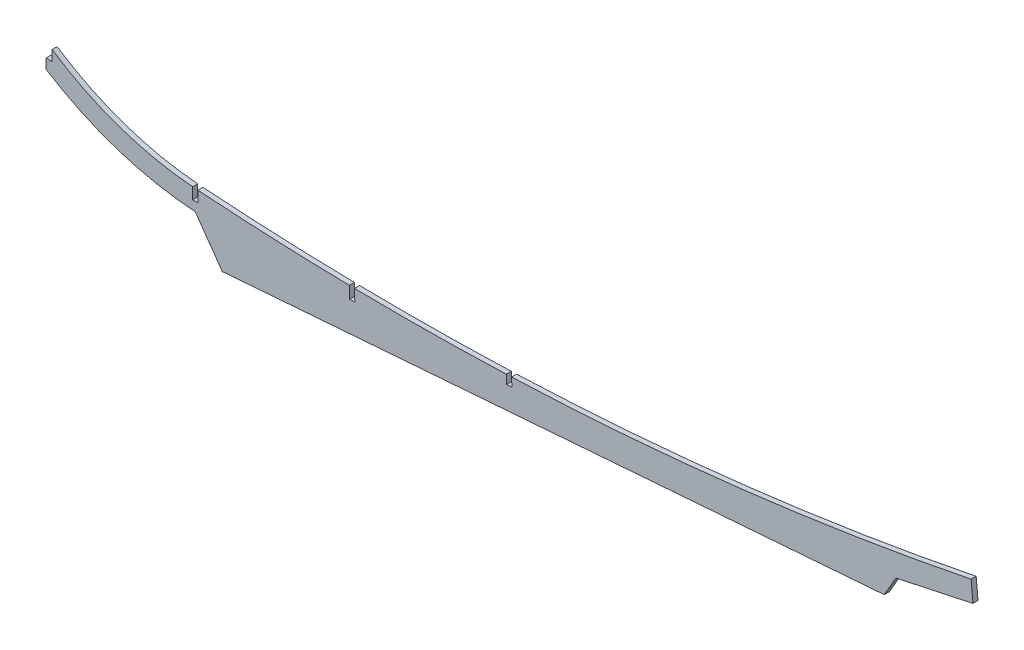
ISO-10303-21;
HEADER;
FILE_DESCRIPTION(('STEP AP214'),'2;1');
FILE_NAME('part.step','',(''),(''),'','','');
FILE_SCHEMA(('AUTOMOTIVE_DESIGN { 1 0 10303 214 1 1 1 1 }'));
ENDSEC;
DATA;
#1=APPLICATION_CONTEXT('core data for automotive mechanical design processes');
#2=APPLICATION_PROTOCOL_DEFINITION('international standard','automotive_design',2000,#1);
#3=PRODUCT_CONTEXT('',#1,'mechanical');
#4=PRODUCT('Part','Part','',(#3));
#5=PRODUCT_RELATED_PRODUCT_CATEGORY('part','',(#4));
#6=PRODUCT_DEFINITION_FORMATION('','',#4);
#7=PRODUCT_DEFINITION_CONTEXT('part definition',#1,'design');
#8=PRODUCT_DEFINITION('design','',#6,#7);
#9=PRODUCT_DEFINITION_SHAPE('','',#8);
#10=(LENGTH_UNIT() NAMED_UNIT(*) SI_UNIT(.MILLI.,.METRE.));
#11=(NAMED_UNIT(*) PLANE_ANGLE_UNIT() SI_UNIT($,.RADIAN.));
#12=(NAMED_UNIT(*) SI_UNIT($,.STERADIAN.) SOLID_ANGLE_UNIT());
#13=UNCERTAINTY_MEASURE_WITH_UNIT(LENGTH_MEASURE(1.E-05),#10,'distance_accuracy_value','');
#14=(GEOMETRIC_REPRESENTATION_CONTEXT(3) GLOBAL_UNCERTAINTY_ASSIGNED_CONTEXT((#13)) GLOBAL_UNIT_ASSIGNED_CONTEXT((#10,
#11,#12)) REPRESENTATION_CONTEXT('',''));
#15=CARTESIAN_POINT('',(0.,0.,0.));
#16=DIRECTION('',(0.,0.,1.));
#17=DIRECTION('',(1.,0.,0.));
#18=AXIS2_PLACEMENT_3D('',#15,#16,#17);
#19=CARTESIAN_POINT('',(223.035341524401,1702.00163611654,1.5875));
#20=DIRECTION('',(0.,0.,-1.));
#21=DIRECTION('',(-1.,0.,0.));
#22=AXIS2_PLACEMENT_3D('',#19,#20,#21);
#23=CYLINDRICAL_SURFACE('',#22,1822.13675841609);
#24=CARTESIAN_POINT('',(223.035341524401,1702.00163611654,-1.5875));
#25=DIRECTION('',(0.,0.,1.));
#26=DIRECTION('',(1.,0.,0.));
#27=AXIS2_PLACEMENT_3D('',#24,#25,#26);
#28=CIRCLE('',#27,1822.13675841609);
#29=CARTESIAN_POINT('',(293.057765069037,-118.789188380336,-1.5875));
#30=VERTEX_POINT('',#29);
#31=CARTESIAN_POINT('',(582.369809331586,-84.3525019582167,-1.5875));
#32=VERTEX_POINT('',#31);
#33=EDGE_CURVE('E215',#30,#32,#28,.T.);
#34=ORIENTED_EDGE('',*,*,#33,.F.);
#35=DIRECTION('',(0.,0.,-1.));
#36=VECTOR('',#35,1.);
#37=CARTESIAN_POINT('',(293.057765069037,-118.789188380336,1.5875));
#38=LINE('',#37,#36);
#39=CARTESIAN_POINT('',(293.057765069037,-118.789188380336,1.5875));
#40=VERTEX_POINT('',#39);
#41=EDGE_CURVE('E11',#40,#30,#38,.T.);
#42=ORIENTED_EDGE('',*,*,#41,.F.);
#43=CARTESIAN_POINT('',(223.035341524401,1702.00163611654,1.5875));
#44=DIRECTION('',(0.,0.,1.));
#45=DIRECTION('',(1.,0.,0.));
#46=AXIS2_PLACEMENT_3D('',#43,#44,#45);
#47=CIRCLE('',#46,1822.13675841609);
#48=CARTESIAN_POINT('',(582.369809331586,-84.3525019582167,1.5875));
#49=VERTEX_POINT('',#48);
#50=EDGE_CURVE('E273',#40,#49,#47,.T.);
#51=ORIENTED_EDGE('',*,*,#50,.T.);
#52=DIRECTION('',(0.,0.,-1.));
#53=VECTOR('',#52,1.);
#54=CARTESIAN_POINT('',(582.369809331586,-84.3525019582167,1.5875));
#55=LINE('',#54,#53);
#56=EDGE_CURVE('E132',#49,#32,#55,.T.);
#57=ORIENTED_EDGE('',*,*,#56,.T.);
#58=EDGE_LOOP('',(#34,#42,#51,#57));
#59=FACE_BOUND('',#58,.T.);
#60=ADVANCED_FACE('F39',(#59),#23,.F.);
#61=CARTESIAN_POINT('',(287.412679305903,12.3702094611246,1.5875));
#62=DIRECTION('',(-0.999075068861156,-0.0430000788380186,0.));
#63=DIRECTION('',(0.0430000788380186,-0.999075068861156,0.));
#64=AXIS2_PLACEMENT_3D('',#61,#62,#63);
#65=PLANE('',#64);
#66=DIRECTION('',(-0.0430000788380186,0.999075068861156,0.));
#67=VECTOR('',#66,1.);
#68=CARTESIAN_POINT('',(287.412679305903,12.3702094611246,-1.5875));
#69=LINE('',#68,#67);
#70=CARTESIAN_POINT('',(293.291810232831,-124.22705487856,-1.5875));
#71=VERTEX_POINT('',#70);
#72=EDGE_CURVE('E218',#71,#30,#69,.T.);
#73=ORIENTED_EDGE('',*,*,#72,.F.);
#74=DIRECTION('',(0.,0.,-1.));
#75=VECTOR('',#74,1.);
#76=CARTESIAN_POINT('',(293.291810232831,-124.22705487856,1.5875));
#77=LINE('',#76,#75);
#78=CARTESIAN_POINT('',(293.291810232831,-124.22705487856,1.5875));
#79=VERTEX_POINT('',#78);
#80=EDGE_CURVE('E47',#79,#71,#77,.T.);
#81=ORIENTED_EDGE('',*,*,#80,.F.);
#82=DIRECTION('',(-0.0430000788380186,0.999075068861156,0.));
#83=VECTOR('',#82,1.);
#84=CARTESIAN_POINT('',(287.412679305903,12.3702094611246,1.5875));
#85=LINE('',#84,#83);
#86=EDGE_CURVE('E335',#79,#40,#85,.T.);
#87=ORIENTED_EDGE('',*,*,#86,.T.);
#88=ORIENTED_EDGE('',*,*,#41,.T.);
#89=EDGE_LOOP('',(#73,#81,#87,#88));
#90=FACE_BOUND('',#89,.T.);
#91=ADVANCED_FACE('F320',(#90),#65,.T.);
#92=CARTESIAN_POINT('',(5.87913092691155,-136.597264339654,1.5875));
#93=DIRECTION('',(-0.0430000788379098,0.999075068861161,0.));
#94=DIRECTION('',(-0.999075068861161,-0.0430000788379098,0.));
#95=AXIS2_PLACEMENT_3D('',#92,#93,#94);
#96=PLANE('',#95);
#97=DIRECTION('',(0.999075068861161,0.0430000788379098,0.));
#98=VECTOR('',#97,1.);
#99=CARTESIAN_POINT('',(5.87913092691155,-136.597264339654,-1.5875));
#100=LINE('',#99,#98);
#101=CARTESIAN_POINT('',(289.992864355451,-124.369041138883,-1.5875));
#102=VERTEX_POINT('',#101);
#103=EDGE_CURVE('E221',#102,#71,#100,.T.);
#104=ORIENTED_EDGE('',*,*,#103,.F.);
#105=DIRECTION('',(0.,0.,-1.));
#106=VECTOR('',#105,1.);
#107=CARTESIAN_POINT('',(289.992864355451,-124.369041138883,1.5875));
#108=LINE('',#107,#106);
#109=CARTESIAN_POINT('',(289.992864355451,-124.369041138883,1.5875));
#110=VERTEX_POINT('',#109);
#111=EDGE_CURVE('E309',#110,#102,#108,.T.);
#112=ORIENTED_EDGE('',*,*,#111,.F.);
#113=DIRECTION('',(0.999075068861161,0.0430000788379098,0.));
#114=VECTOR('',#113,1.);
#115=CARTESIAN_POINT('',(5.87913092691155,-136.597264339654,1.5875));
#116=LINE('',#115,#114);
#117=EDGE_CURVE('E316',#110,#79,#116,.T.);
#118=ORIENTED_EDGE('',*,*,#117,.T.);
#119=ORIENTED_EDGE('',*,*,#80,.T.);
#120=EDGE_LOOP('',(#104,#112,#118,#119));
#121=FACE_BOUND('',#120,.T.);
#122=ADVANCED_FACE('F314',(#121),#96,.T.);
#123=CARTESIAN_POINT('',(284.113733428526,12.2282232007967,1.5875));
#124=DIRECTION('',(-0.999075068861157,-0.0430000788380014,0.));
#125=DIRECTION('',(0.0430000788380014,-0.999075068861157,0.));
#126=AXIS2_PLACEMENT_3D('',#123,#124,#125);
#127=PLANE('',#126);
#128=DIRECTION('',(-0.0430000788380014,0.999075068861157,0.));
#129=VECTOR('',#128,1.);
#130=CARTESIAN_POINT('',(284.113733428526,12.2282232007967,-1.5875));
#131=LINE('',#130,#129);
#132=CARTESIAN_POINT('',(289.758040924917,-118.913092187832,-1.5875));
#133=VERTEX_POINT('',#132);
#134=EDGE_CURVE('E224',#102,#133,#131,.T.);
#135=ORIENTED_EDGE('',*,*,#134,.T.);
#136=DIRECTION('',(0.,0.,-1.));
#137=VECTOR('',#136,1.);
#138=CARTESIAN_POINT('',(289.758040924917,-118.913092187832,1.5875));
#139=LINE('',#138,#137);
#140=CARTESIAN_POINT('',(289.758040924917,-118.913092187832,1.5875));
#141=VERTEX_POINT('',#140);
#142=EDGE_CURVE('E307',#141,#133,#139,.T.);
#143=ORIENTED_EDGE('',*,*,#142,.F.);
#144=DIRECTION('',(-0.0430000788380014,0.999075068861157,0.));
#145=VECTOR('',#144,1.);
#146=CARTESIAN_POINT('',(284.113733428526,12.2282232007967,1.5875));
#147=LINE('',#146,#145);
#148=EDGE_CURVE('E331',#110,#141,#147,.T.);
#149=ORIENTED_EDGE('',*,*,#148,.F.);
#150=ORIENTED_EDGE('',*,*,#111,.T.);
#151=EDGE_LOOP('',(#135,#143,#149,#150));
#152=FACE_BOUND('',#151,.T.);
#153=ADVANCED_FACE('F328',(#152),#127,.F.);
#154=CARTESIAN_POINT('',(223.035341524401,1702.00163611654,1.5875));
#155=DIRECTION('',(0.,0.,-1.));
#156=DIRECTION('',(-1.,0.,0.));
#157=AXIS2_PLACEMENT_3D('',#154,#155,#156);
#158=CYLINDRICAL_SURFACE('',#157,1822.13675841609);
#159=CARTESIAN_POINT('',(223.035341524401,1702.00163611654,-1.5875));
#160=DIRECTION('',(0.,0.,1.));
#161=DIRECTION('',(1.,0.,0.));
#162=AXIS2_PLACEMENT_3D('',#159,#160,#161);
#163=CIRCLE('',#162,1822.13675841609);
#164=CARTESIAN_POINT('',(194.235436281596,-119.907508662387,-1.5875));
#165=VERTEX_POINT('',#164);
#166=EDGE_CURVE('E227',#165,#133,#163,.T.);
#167=ORIENTED_EDGE('',*,*,#166,.F.);
#168=DIRECTION('',(0.,0.,-1.));
#169=VECTOR('',#168,1.);
#170=CARTESIAN_POINT('',(194.235436281596,-119.907508662387,1.5875));
#171=LINE('',#170,#169);
#172=CARTESIAN_POINT('',(194.235436281596,-119.907508662387,1.5875));
#173=VERTEX_POINT('',#172);
#174=EDGE_CURVE('E305',#173,#165,#171,.T.);
#175=ORIENTED_EDGE('',*,*,#174,.F.);
#176=CARTESIAN_POINT('',(223.035341524401,1702.00163611654,1.5875));
#177=DIRECTION('',(0.,0.,1.));
#178=DIRECTION('',(1.,0.,0.));
#179=AXIS2_PLACEMENT_3D('',#176,#177,#178);
#180=CIRCLE('',#179,1822.13675841609);
#181=EDGE_CURVE('E333',#173,#141,#180,.T.);
#182=ORIENTED_EDGE('',*,*,#181,.T.);
#183=ORIENTED_EDGE('',*,*,#142,.T.);
#184=EDGE_LOOP('',(#167,#175,#182,#183));
#185=FACE_BOUND('',#184,.T.);
#186=ADVANCED_FACE('F400',(#185),#158,.F.);
#187=CARTESIAN_POINT('',(191.64119605423,4.01198617440464,1.5875));
#188=DIRECTION('',(0.999780937323449,0.0209302977677093,0.));
#189=DIRECTION('',(-0.0209302977677093,0.99978093732345,0.));
#190=AXIS2_PLACEMENT_3D('',#187,#188,#189);
#191=PLANE('',#190);
#192=DIRECTION('',(0.0209302977677093,-0.99978093732345,0.));
#193=VECTOR('',#192,1.);
#194=CARTESIAN_POINT('',(191.64119605423,4.01198617440464,-1.5875));
#195=LINE('',#194,#193);
#196=CARTESIAN_POINT('',(194.389608854953,-127.271895046712,-1.5875));
#197=VERTEX_POINT('',#196);
#198=EDGE_CURVE('E230',#165,#197,#195,.T.);
#199=ORIENTED_EDGE('',*,*,#198,.T.);
#200=DIRECTION('',(0.,0.,-1.));
#201=VECTOR('',#200,1.);
#202=CARTESIAN_POINT('',(194.389608854953,-127.271895046712,1.5875));
#203=LINE('',#202,#201);
#204=CARTESIAN_POINT('',(194.389608854953,-127.271895046712,1.5875));
#205=VERTEX_POINT('',#204);
#206=EDGE_CURVE('E303',#205,#197,#203,.T.);
#207=ORIENTED_EDGE('',*,*,#206,.F.);
#208=DIRECTION('',(0.0209302977677093,-0.99978093732345,0.));
#209=VECTOR('',#208,1.);
#210=CARTESIAN_POINT('',(191.64119605423,4.01198617440464,1.5875));
#211=LINE('',#210,#209);
#212=EDGE_CURVE('E341',#173,#205,#211,.T.);
#213=ORIENTED_EDGE('',*,*,#212,.F.);
#214=ORIENTED_EDGE('',*,*,#174,.T.);
#215=EDGE_LOOP('',(#199,#207,#213,#214));
#216=FACE_BOUND('',#215,.T.);
#217=ADVANCED_FACE('F403',(#216),#191,.F.);
#218=CARTESIAN_POINT('',(2.74841280072267,-131.283881221117,1.5875));
#219=DIRECTION('',(-0.0209302977677072,0.99978093732345,0.));
#220=DIRECTION('',(-0.99978093732345,-0.0209302977677072,0.));
#221=AXIS2_PLACEMENT_3D('',#218,#219,#220);
#222=PLANE('',#221);
#223=DIRECTION('',(0.99978093732345,0.0209302977677072,0.));
#224=VECTOR('',#223,1.);
#225=CARTESIAN_POINT('',(2.74841280072267,-131.283881221117,-1.5875));
#226=LINE('',#225,#224);
#227=CARTESIAN_POINT('',(191.088332199911,-127.341006889941,-1.5875));
#228=VERTEX_POINT('',#227);
#229=EDGE_CURVE('E233',#228,#197,#226,.T.);
#230=ORIENTED_EDGE('',*,*,#229,.F.);
#231=DIRECTION('',(0.,0.,-1.));
#232=VECTOR('',#231,1.);
#233=CARTESIAN_POINT('',(191.088332199911,-127.341006889941,1.5875));
#234=LINE('',#233,#232);
#235=CARTESIAN_POINT('',(191.088332199911,-127.341006889941,1.5875));
#236=VERTEX_POINT('',#235);
#237=EDGE_CURVE('E301',#236,#228,#234,.T.);
#238=ORIENTED_EDGE('',*,*,#237,.F.);
#239=DIRECTION('',(0.99978093732345,0.0209302977677072,0.));
#240=VECTOR('',#239,1.);
#241=CARTESIAN_POINT('',(2.74841280072267,-131.283881221117,1.5875));
#242=LINE('',#241,#240);
#243=EDGE_CURVE('E343',#236,#205,#242,.T.);
#244=ORIENTED_EDGE('',*,*,#243,.T.);
#245=ORIENTED_EDGE('',*,*,#206,.T.);
#246=EDGE_LOOP('',(#230,#238,#244,#245));
#247=FACE_BOUND('',#246,.T.);
#248=ADVANCED_FACE('F407',(#247),#222,.T.);
#249=CARTESIAN_POINT('',(188.339919399188,3.9428743311757,1.5875));
#250=DIRECTION('',(0.999780937323449,0.0209302977677095,0.));
#251=DIRECTION('',(-0.0209302977677095,0.99978093732345,0.));
#252=AXIS2_PLACEMENT_3D('',#249,#250,#251);
#253=PLANE('',#252);
#254=DIRECTION('',(0.0209302977677095,-0.99978093732345,0.));
#255=VECTOR('',#254,1.);
#256=CARTESIAN_POINT('',(188.339919399188,3.9428743311757,-1.5875));
#257=LINE('',#256,#255);
#258=CARTESIAN_POINT('',(190.931556697202,-119.852285955932,-1.5875));
#259=VERTEX_POINT('',#258);
#260=EDGE_CURVE('E236',#259,#228,#257,.T.);
#261=ORIENTED_EDGE('',*,*,#260,.F.);
#262=DIRECTION('',(0.,0.,-1.));
#263=VECTOR('',#262,1.);
#264=CARTESIAN_POINT('',(190.931556697202,-119.852285955932,1.5875));
#265=LINE('',#264,#263);
#266=CARTESIAN_POINT('',(190.931556697202,-119.852285955932,1.5875));
#267=VERTEX_POINT('',#266);
#268=EDGE_CURVE('E299',#267,#259,#265,.T.);
#269=ORIENTED_EDGE('',*,*,#268,.F.);
#270=DIRECTION('',(0.0209302977677095,-0.99978093732345,0.));
#271=VECTOR('',#270,1.);
#272=CARTESIAN_POINT('',(188.339919399188,3.9428743311757,1.5875));
#273=LINE('',#272,#271);
#274=EDGE_CURVE('E346',#267,#236,#273,.T.);
#275=ORIENTED_EDGE('',*,*,#274,.T.);
#276=ORIENTED_EDGE('',*,*,#237,.T.);
#277=EDGE_LOOP('',(#261,#269,#275,#276));
#278=FACE_BOUND('',#277,.T.);
#279=ADVANCED_FACE('F411',(#278),#253,.T.);
#280=CARTESIAN_POINT('',(223.035341524401,1702.00163611654,1.5875));
#281=DIRECTION('',(0.,0.,-1.));
#282=DIRECTION('',(-1.,0.,0.));
#283=AXIS2_PLACEMENT_3D('',#280,#281,#282);
#284=CYLINDRICAL_SURFACE('',#283,1822.13675841609);
#285=CARTESIAN_POINT('',(223.035341524401,1702.00163611654,-1.5875));
#286=DIRECTION('',(0.,0.,1.));
#287=DIRECTION('',(1.,0.,0.));
#288=AXIS2_PLACEMENT_3D('',#285,#286,#287);
#289=CIRCLE('',#288,1822.13675841609);
#290=CARTESIAN_POINT('',(95.6310000000009,-115.675590492138,-1.5875));
#291=VERTEX_POINT('',#290);
#292=EDGE_CURVE('E239',#291,#259,#289,.T.);
#293=ORIENTED_EDGE('',*,*,#292,.F.);
#294=DIRECTION('',(0.,0.,-1.));
#295=VECTOR('',#294,1.);
#296=CARTESIAN_POINT('',(95.6310000000009,-115.675590492138,1.5875));
#297=LINE('',#296,#295);
#298=CARTESIAN_POINT('',(95.6310000000009,-115.675590492138,1.5875));
#299=VERTEX_POINT('',#298);
#300=EDGE_CURVE('E297',#299,#291,#297,.T.);
#301=ORIENTED_EDGE('',*,*,#300,.F.);
#302=CARTESIAN_POINT('',(223.035341524401,1702.00163611654,1.5875));
#303=DIRECTION('',(0.,0.,1.));
#304=DIRECTION('',(1.,0.,0.));
#305=AXIS2_PLACEMENT_3D('',#302,#303,#304);
#306=CIRCLE('',#305,1822.13675841609);
#307=EDGE_CURVE('E349',#299,#267,#306,.T.);
#308=ORIENTED_EDGE('',*,*,#307,.T.);
#309=ORIENTED_EDGE('',*,*,#268,.T.);
#310=EDGE_LOOP('',(#293,#301,#308,#309));
#311=FACE_BOUND('',#310,.T.);
#312=ADVANCED_FACE('F415',(#311),#284,.F.);
#313=CARTESIAN_POINT('',(95.6310000000009,0.,1.5875));
#314=DIRECTION('',(-1.,0.,0.));
#315=DIRECTION('',(0.,0.,1.));
#316=AXIS2_PLACEMENT_3D('',#313,#314,#315);
#317=PLANE('',#316);
#318=DIRECTION('',(0.,1.,0.));
#319=VECTOR('',#318,1.);
#320=CARTESIAN_POINT('',(95.6310000000009,0.,-1.5875));
#321=LINE('',#320,#319);
#322=CARTESIAN_POINT('',(95.6310000000009,-122.533590492138,-1.5875));
#323=VERTEX_POINT('',#322);
#324=EDGE_CURVE('E242',#323,#291,#321,.T.);
#325=ORIENTED_EDGE('',*,*,#324,.F.);
#326=DIRECTION('',(0.,0.,-1.));
#327=VECTOR('',#326,1.);
#328=CARTESIAN_POINT('',(95.6310000000009,-122.533590492138,1.5875));
#329=LINE('',#328,#327);
#330=CARTESIAN_POINT('',(95.6310000000009,-122.533590492138,1.5875));
#331=VERTEX_POINT('',#330);
#332=EDGE_CURVE('E295',#331,#323,#329,.T.);
#333=ORIENTED_EDGE('',*,*,#332,.F.);
#334=DIRECTION('',(0.,1.,0.));
#335=VECTOR('',#334,1.);
#336=CARTESIAN_POINT('',(95.6310000000009,0.,1.5875));
#337=LINE('',#336,#335);
#338=EDGE_CURVE('E352',#331,#299,#337,.T.);
#339=ORIENTED_EDGE('',*,*,#338,.T.);
#340=ORIENTED_EDGE('',*,*,#300,.T.);
#341=EDGE_LOOP('',(#325,#333,#339,#340));
#342=FACE_BOUND('',#341,.T.);
#343=ADVANCED_FACE('F419',(#342),#317,.T.);
#344=CARTESIAN_POINT('',(0.,-122.533590492138,1.5875));
#345=DIRECTION('',(0.,1.,0.));
#346=DIRECTION('',(0.,0.,1.));
#347=AXIS2_PLACEMENT_3D('',#344,#345,#346);
#348=PLANE('',#347);
#349=DIRECTION('',(1.,0.,0.));
#350=VECTOR('',#349,1.);
#351=CARTESIAN_POINT('',(0.,-122.533590492138,-1.5875));
#352=LINE('',#351,#350);
#353=CARTESIAN_POINT('',(92.3290000000009,-122.533590492138,-1.5875));
#354=VERTEX_POINT('',#353);
#355=EDGE_CURVE('E245',#354,#323,#352,.T.);
#356=ORIENTED_EDGE('',*,*,#355,.F.);
#357=DIRECTION('',(0.,0.,-1.));
#358=VECTOR('',#357,1.);
#359=CARTESIAN_POINT('',(92.3290000000009,-122.533590492138,1.5875));
#360=LINE('',#359,#358);
#361=CARTESIAN_POINT('',(92.3290000000009,-122.533590492138,1.5875));
#362=VERTEX_POINT('',#361);
#363=EDGE_CURVE('E293',#362,#354,#360,.T.);
#364=ORIENTED_EDGE('',*,*,#363,.F.);
#365=DIRECTION('',(1.,0.,0.));
#366=VECTOR('',#365,1.);
#367=CARTESIAN_POINT('',(0.,-122.533590492138,1.5875));
#368=LINE('',#367,#366);
#369=EDGE_CURVE('E355',#362,#331,#368,.T.);
#370=ORIENTED_EDGE('',*,*,#369,.T.);
#371=ORIENTED_EDGE('',*,*,#332,.T.);
#372=EDGE_LOOP('',(#356,#364,#370,#371));
#373=FACE_BOUND('',#372,.T.);
#374=ADVANCED_FACE('F423',(#373),#348,.T.);
#375=CARTESIAN_POINT('',(92.3290000000009,0.,1.5875));
#376=DIRECTION('',(-1.,0.,0.));
#377=DIRECTION('',(0.,0.,1.));
#378=AXIS2_PLACEMENT_3D('',#375,#376,#377);
#379=PLANE('',#378);
#380=DIRECTION('',(0.,1.,0.));
#381=VECTOR('',#380,1.);
#382=CARTESIAN_POINT('',(92.3290000000009,0.,-1.5875));
#383=LINE('',#382,#381);
#384=CARTESIAN_POINT('',(92.3290000000009,-115.43454425333,-1.5875));
#385=VERTEX_POINT('',#384);
#386=EDGE_CURVE('E248',#354,#385,#383,.T.);
#387=ORIENTED_EDGE('',*,*,#386,.T.);
#388=DIRECTION('',(0.,0.,-1.));
#389=VECTOR('',#388,1.);
#390=CARTESIAN_POINT('',(92.3290000000009,-115.43454425333,1.5875));
#391=LINE('',#390,#389);
#392=CARTESIAN_POINT('',(92.3290000000009,-115.43454425333,1.5875));
#393=VERTEX_POINT('',#392);
#394=EDGE_CURVE('E291',#393,#385,#391,.T.);
#395=ORIENTED_EDGE('',*,*,#394,.F.);
#396=DIRECTION('',(0.,1.,0.));
#397=VECTOR('',#396,1.);
#398=CARTESIAN_POINT('',(92.3290000000009,0.,1.5875));
#399=LINE('',#398,#397);
#400=EDGE_CURVE('E358',#362,#393,#399,.T.);
#401=ORIENTED_EDGE('',*,*,#400,.F.);
#402=ORIENTED_EDGE('',*,*,#363,.T.);
#403=EDGE_LOOP('',(#387,#395,#401,#402));
#404=FACE_BOUND('',#403,.T.);
#405=ADVANCED_FACE('F427',(#404),#379,.F.);
#406=CARTESIAN_POINT('',(107.235093104916,71.12,1.5875));
#407=DIRECTION('',(0.,0.,-1.));
#408=DIRECTION('',(-1.,0.,0.));
#409=AXIS2_PLACEMENT_3D('',#406,#407,#408);
#410=CYLINDRICAL_SURFACE('',#409,187.149110586238);
#411=CARTESIAN_POINT('',(107.235093104916,71.12,-1.5875));
#412=DIRECTION('',(0.,0.,1.));
#413=DIRECTION('',(1.,0.,0.));
#414=AXIS2_PLACEMENT_3D('',#411,#412,#413);
#415=CIRCLE('',#414,187.149110586238);
#416=CARTESIAN_POINT('',(3.81000000000001,-84.8544841615431,-1.5875));
#417=VERTEX_POINT('',#416);
#418=EDGE_CURVE('E251',#417,#385,#415,.T.);
#419=ORIENTED_EDGE('',*,*,#418,.F.);
#420=DIRECTION('',(0.,0.,-1.));
#421=VECTOR('',#420,1.);
#422=CARTESIAN_POINT('',(3.81000000000001,-84.8544841615431,1.5875));
#423=LINE('',#422,#421);
#424=CARTESIAN_POINT('',(3.81000000000001,-84.8544841615431,1.5875));
#425=VERTEX_POINT('',#424);
#426=EDGE_CURVE('E289',#425,#417,#423,.T.);
#427=ORIENTED_EDGE('',*,*,#426,.F.);
#428=CARTESIAN_POINT('',(107.235093104916,71.12,1.5875));
#429=DIRECTION('',(0.,0.,1.));
#430=DIRECTION('',(1.,0.,0.));
#431=AXIS2_PLACEMENT_3D('',#428,#429,#430);
#432=CIRCLE('',#431,187.149110586238);
#433=EDGE_CURVE('E360',#425,#393,#432,.T.);
#434=ORIENTED_EDGE('',*,*,#433,.T.);
#435=ORIENTED_EDGE('',*,*,#394,.T.);
#436=EDGE_LOOP('',(#419,#427,#434,#435));
#437=FACE_BOUND('',#436,.T.);
#438=ADVANCED_FACE('F431',(#437),#410,.F.);
#439=CARTESIAN_POINT('',(3.80999999999998,0.,1.5875));
#440=DIRECTION('',(-1.,0.,0.));
#441=DIRECTION('',(0.,-1.,0.));
#442=AXIS2_PLACEMENT_3D('',#439,#440,#441);
#443=PLANE('',#442);
#444=DIRECTION('',(0.,1.,0.));
#445=VECTOR('',#444,1.);
#446=CARTESIAN_POINT('',(3.80999999999998,0.,-1.5875));
#447=LINE('',#446,#445);
#448=CARTESIAN_POINT('',(3.81000000000001,-91.4584841615431,-1.5875));
#449=VERTEX_POINT('',#448);
#450=EDGE_CURVE('E254',#449,#417,#447,.T.);
#451=ORIENTED_EDGE('',*,*,#450,.F.);
#452=DIRECTION('',(0.,0.,-1.));
#453=VECTOR('',#452,1.);
#454=CARTESIAN_POINT('',(3.81000000000001,-91.4584841615431,1.5875));
#455=LINE('',#454,#453);
#456=CARTESIAN_POINT('',(3.81000000000001,-91.4584841615431,1.5875));
#457=VERTEX_POINT('',#456);
#458=EDGE_CURVE('E287',#457,#449,#455,.T.);
#459=ORIENTED_EDGE('',*,*,#458,.F.);
#460=DIRECTION('',(0.,1.,0.));
#461=VECTOR('',#460,1.);
#462=CARTESIAN_POINT('',(3.80999999999998,0.,1.5875));
#463=LINE('',#462,#461);
#464=EDGE_CURVE('E363',#457,#425,#463,.T.);
#465=ORIENTED_EDGE('',*,*,#464,.T.);
#466=ORIENTED_EDGE('',*,*,#426,.T.);
#467=EDGE_LOOP('',(#451,#459,#465,#466));
#468=FACE_BOUND('',#467,.T.);
#469=ADVANCED_FACE('F435',(#468),#443,.T.);
#470=CARTESIAN_POINT('',(0.,-91.4584841615431,1.5875));
#471=DIRECTION('',(0.,1.,0.));
#472=DIRECTION('',(0.,0.,1.));
#473=AXIS2_PLACEMENT_3D('',#470,#471,#472);
#474=PLANE('',#473);
#475=DIRECTION('',(1.,0.,0.));
#476=VECTOR('',#475,1.);
#477=CARTESIAN_POINT('',(0.,-91.4584841615431,-1.5875));
#478=LINE('',#477,#476);
#479=CARTESIAN_POINT('',(0.,-91.4584841615431,-1.5875));
#480=VERTEX_POINT('',#479);
#481=EDGE_CURVE('E257',#480,#449,#478,.T.);
#482=ORIENTED_EDGE('',*,*,#481,.F.);
#483=DIRECTION('',(0.,0.,-1.));
#484=VECTOR('',#483,1.);
#485=CARTESIAN_POINT('',(0.,-91.4584841615431,1.5875));
#486=LINE('',#485,#484);
#487=CARTESIAN_POINT('',(0.,-91.4584841615431,1.5875));
#488=VERTEX_POINT('',#487);
#489=EDGE_CURVE('E285',#488,#480,#486,.T.);
#490=ORIENTED_EDGE('',*,*,#489,.F.);
#491=DIRECTION('',(1.,0.,0.));
#492=VECTOR('',#491,1.);
#493=CARTESIAN_POINT('',(0.,-91.4584841615431,1.5875));
#494=LINE('',#493,#492);
#495=EDGE_CURVE('E366',#488,#457,#494,.T.);
#496=ORIENTED_EDGE('',*,*,#495,.T.);
#497=ORIENTED_EDGE('',*,*,#458,.T.);
#498=EDGE_LOOP('',(#482,#490,#496,#497));
#499=FACE_BOUND('',#498,.T.);
#500=ADVANCED_FACE('F439',(#499),#474,.T.);
#501=CARTESIAN_POINT('',(3.52919741361245E-12,0.,1.5875));
#502=DIRECTION('',(-1.,0.,0.));
#503=DIRECTION('',(0.,-1.,0.));
#504=AXIS2_PLACEMENT_3D('',#501,#502,#503);
#505=PLANE('',#504);
#506=DIRECTION('',(0.,1.,0.));
#507=VECTOR('',#506,1.);
#508=CARTESIAN_POINT('',(3.52919741361245E-12,0.,-1.5875));
#509=LINE('',#508,#507);
#510=CARTESIAN_POINT('',(-2.22044604925031E-13,-97.5,-1.5875));
#511=VERTEX_POINT('',#510);
#512=EDGE_CURVE('E260',#511,#480,#509,.T.);
#513=ORIENTED_EDGE('',*,*,#512,.F.);
#514=DIRECTION('',(0.,0.,-1.));
#515=VECTOR('',#514,1.);
#516=CARTESIAN_POINT('',(-2.22044604925031E-13,-97.5,1.5875));
#517=LINE('',#516,#515);
#518=CARTESIAN_POINT('',(-2.22044604925031E-13,-97.5,1.5875));
#519=VERTEX_POINT('',#518);
#520=EDGE_CURVE('E283',#519,#511,#517,.T.);
#521=ORIENTED_EDGE('',*,*,#520,.F.);
#522=DIRECTION('',(0.,1.,0.));
#523=VECTOR('',#522,1.);
#524=CARTESIAN_POINT('',(3.52919741361245E-12,0.,1.5875));
#525=LINE('',#524,#523);
#526=EDGE_CURVE('E369',#519,#488,#525,.T.);
#527=ORIENTED_EDGE('',*,*,#526,.T.);
#528=ORIENTED_EDGE('',*,*,#489,.T.);
#529=EDGE_LOOP('',(#513,#521,#527,#528));
#530=FACE_BOUND('',#529,.T.);
#531=ADVANCED_FACE('F443',(#530),#505,.T.);
#532=CARTESIAN_POINT('',(107.235093104916,71.12,1.5875));
#533=DIRECTION('',(0.,0.,-1.));
#534=DIRECTION('',(-1.,0.,0.));
#535=AXIS2_PLACEMENT_3D('',#532,#533,#534);
#536=CYLINDRICAL_SURFACE('',#535,199.830101819571);
#537=CARTESIAN_POINT('',(107.235093104916,71.12,-1.5875));
#538=DIRECTION('',(0.,0.,1.));
#539=DIRECTION('',(1.,0.,0.));
#540=AXIS2_PLACEMENT_3D('',#537,#538,#539);
#541=CIRCLE('',#540,199.830101819571);
#542=CARTESIAN_POINT('',(93.9799999999999,-128.27,-1.5875));
#543=VERTEX_POINT('',#542);
#544=EDGE_CURVE('E263',#511,#543,#541,.T.);
#545=ORIENTED_EDGE('',*,*,#544,.T.);
#546=DIRECTION('',(0.,0.,-1.));
#547=VECTOR('',#546,1.);
#548=CARTESIAN_POINT('',(93.9799999999999,-128.27,1.5875));
#549=LINE('',#548,#547);
#550=CARTESIAN_POINT('',(93.9799999999999,-128.27,1.5875));
#551=VERTEX_POINT('',#550);
#552=EDGE_CURVE('E280',#551,#543,#549,.T.);
#553=ORIENTED_EDGE('',*,*,#552,.F.);
#554=CARTESIAN_POINT('',(107.235093104916,71.12,1.5875));
#555=DIRECTION('',(0.,0.,1.));
#556=DIRECTION('',(1.,0.,0.));
#557=AXIS2_PLACEMENT_3D('',#554,#555,#556);
#558=CIRCLE('',#557,199.830101819571);
#559=EDGE_CURVE('E372',#519,#551,#558,.T.);
#560=ORIENTED_EDGE('',*,*,#559,.F.);
#561=ORIENTED_EDGE('',*,*,#520,.T.);
#562=EDGE_LOOP('',(#545,#553,#560,#561));
#563=FACE_BOUND('',#562,.T.);
#564=ADVANCED_FACE('F447',(#563),#536,.T.);
#565=CARTESIAN_POINT('',(2.22985538438366,1.57563672640154,1.5875));
#566=DIRECTION('',(0.816688031445794,0.577079421997696,0.));
#567=DIRECTION('',(-0.577079421997696,0.816688031445794,0.));
#568=AXIS2_PLACEMENT_3D('',#565,#566,#567);
#569=PLANE('',#568);
#570=DIRECTION('',(0.577079421997696,-0.816688031445794,0.));
#571=VECTOR('',#570,1.);
#572=CARTESIAN_POINT('',(2.22985538438366,1.57563672640154,-1.5875));
#573=LINE('',#572,#571);
#574=CARTESIAN_POINT('',(110.986490965694,-152.33774024361,-1.5875));
#575=VERTEX_POINT('',#574);
#576=EDGE_CURVE('E265',#543,#575,#573,.T.);
#577=ORIENTED_EDGE('',*,*,#576,.T.);
#578=DIRECTION('',(0.,0.,-1.));
#579=VECTOR('',#578,1.);
#580=CARTESIAN_POINT('',(110.986490965694,-152.33774024361,1.5875));
#581=LINE('',#580,#579);
#582=CARTESIAN_POINT('',(110.986490965694,-152.33774024361,1.5875));
#583=VERTEX_POINT('',#582);
#584=EDGE_CURVE('E277',#583,#575,#581,.T.);
#585=ORIENTED_EDGE('',*,*,#584,.F.);
#586=DIRECTION('',(0.577079421997696,-0.816688031445794,0.));
#587=VECTOR('',#586,1.);
#588=CARTESIAN_POINT('',(2.22985538438366,1.57563672640154,1.5875));
#589=LINE('',#588,#587);
#590=EDGE_CURVE('E374',#551,#583,#589,.T.);
#591=ORIENTED_EDGE('',*,*,#590,.F.);
#592=ORIENTED_EDGE('',*,*,#552,.T.);
#593=EDGE_LOOP('',(#577,#585,#591,#592));
#594=FACE_BOUND('',#593,.T.);
#595=ADVANCED_FACE('F381',(#594),#569,.F.);
#596=CARTESIAN_POINT('',(12.3596923978808,-159.958449832639,1.5875));
#597=DIRECTION('',(-0.0770385113227414,0.997028117844816,0.));
#598=DIRECTION('',(-0.997028117844816,-0.0770385113227414,0.));
#599=AXIS2_PLACEMENT_3D('',#596,#597,#598);
#600=PLANE('',#599);
#601=DIRECTION('',(0.997028117844816,0.0770385113227414,0.));
#602=VECTOR('',#601,1.);
#603=CARTESIAN_POINT('',(12.3596923978808,-159.958449832639,-1.5875));
#604=LINE('',#603,#602);
#605=CARTESIAN_POINT('',(527.710073755712,-120.138282799403,-1.5875));
#606=VERTEX_POINT('',#605);
#607=EDGE_CURVE('E267',#575,#606,#604,.T.);
#608=ORIENTED_EDGE('',*,*,#607,.T.);
#609=DIRECTION('',(0.,0.,-1.));
#610=VECTOR('',#609,1.);
#611=CARTESIAN_POINT('',(527.710073755712,-120.138282799403,1.5875));
#612=LINE('',#611,#610);
#613=CARTESIAN_POINT('',(527.710073755712,-120.138282799403,1.5875));
#614=VERTEX_POINT('',#613);
#615=EDGE_CURVE('E207',#614,#606,#612,.T.);
#616=ORIENTED_EDGE('',*,*,#615,.F.);
#617=DIRECTION('',(0.997028117844816,0.0770385113227414,0.));
#618=VECTOR('',#617,1.);
#619=CARTESIAN_POINT('',(12.3596923978808,-159.958449832639,1.5875));
#620=LINE('',#619,#618);
#621=EDGE_CURVE('E198',#583,#614,#620,.T.);
#622=ORIENTED_EDGE('',*,*,#621,.F.);
#623=ORIENTED_EDGE('',*,*,#584,.T.);
#624=EDGE_LOOP('',(#608,#616,#622,#623));
#625=FACE_BOUND('',#624,.T.);
#626=ADVANCED_FACE('F385',(#625),#600,.F.);
#627=CARTESIAN_POINT('',(447.803957752439,-258.539735552559,1.5875));
#628=DIRECTION('',(-0.866025403784431,0.500000000000013,0.));
#629=DIRECTION('',(-0.500000000000013,-0.866025403784431,0.));
#630=AXIS2_PLACEMENT_3D('',#627,#628,#629);
#631=PLANE('',#630);
#632=DIRECTION('',(0.500000000000013,0.866025403784431,0.));
#633=VECTOR('',#632,1.);
#634=CARTESIAN_POINT('',(447.803957752439,-258.539735552559,-1.5875));
#635=LINE('',#634,#633);
#636=CARTESIAN_POINT('',(535.066845951818,-107.395979576036,-1.5875));
#637=VERTEX_POINT('',#636);
#638=EDGE_CURVE('E206',#606,#637,#635,.T.);
#639=ORIENTED_EDGE('',*,*,#638,.T.);
#640=DIRECTION('',(0.,0.,-1.));
#641=VECTOR('',#640,1.);
#642=CARTESIAN_POINT('',(535.066845951818,-107.395979576036,1.5875));
#643=LINE('',#642,#641);
#644=CARTESIAN_POINT('',(535.066845951818,-107.395979576036,1.5875));
#645=VERTEX_POINT('',#644);
#646=EDGE_CURVE('E203',#645,#637,#643,.T.);
#647=ORIENTED_EDGE('',*,*,#646,.F.);
#648=DIRECTION('',(0.500000000000013,0.866025403784431,0.));
#649=VECTOR('',#648,1.);
#650=CARTESIAN_POINT('',(447.803957752439,-258.539735552559,1.5875));
#651=LINE('',#650,#649);
#652=EDGE_CURVE('E192',#614,#645,#651,.T.);
#653=ORIENTED_EDGE('',*,*,#652,.F.);
#654=ORIENTED_EDGE('',*,*,#615,.T.);
#655=EDGE_LOOP('',(#639,#647,#653,#654));
#656=FACE_BOUND('',#655,.T.);
#657=ADVANCED_FACE('F204',(#656),#631,.F.);
#658=CARTESIAN_POINT('',(45.563407019038,-212.401860353884,1.5875));
#659=DIRECTION('',(-0.209743523567852,0.977756439161278,0.));
#660=DIRECTION('',(-0.977756439161278,-0.209743523567852,0.));
#661=AXIS2_PLACEMENT_3D('',#658,#659,#660);
#662=PLANE('',#661);
#663=DIRECTION('',(0.977756439161278,0.209743523567852,0.));
#664=VECTOR('',#663,1.);
#665=CARTESIAN_POINT('',(45.563407019038,-212.401860353884,-1.5875));
#666=LINE('',#665,#664);
#667=CARTESIAN_POINT('',(583.523082907641,-97.0013848989908,-1.5875));
#668=VERTEX_POINT('',#667);
#669=EDGE_CURVE('E125',#637,#668,#666,.T.);
#670=ORIENTED_EDGE('',*,*,#669,.T.);
#671=DIRECTION('',(0.,0.,-1.));
#672=VECTOR('',#671,1.);
#673=CARTESIAN_POINT('',(583.523082907641,-97.0013848989908,1.5875));
#674=LINE('',#673,#672);
#675=CARTESIAN_POINT('',(583.523082907641,-97.0013848989908,1.5875));
#676=VERTEX_POINT('',#675);
#677=EDGE_CURVE('E208',#676,#668,#674,.T.);
#678=ORIENTED_EDGE('',*,*,#677,.F.);
#679=DIRECTION('',(0.977756439161278,0.209743523567852,0.));
#680=VECTOR('',#679,1.);
#681=CARTESIAN_POINT('',(45.563407019038,-212.401860353884,1.5875));
#682=LINE('',#681,#680);
#683=EDGE_CURVE('E196',#645,#676,#682,.T.);
#684=ORIENTED_EDGE('',*,*,#683,.F.);
#685=ORIENTED_EDGE('',*,*,#646,.T.);
#686=EDGE_LOOP('',(#670,#678,#684,#685));
#687=FACE_BOUND('',#686,.T.);
#688=ADVANCED_FACE('F210',(#687),#662,.F.);
#689=CARTESIAN_POINT('',(569.94094515583,51.9648916854905,1.5875));
#690=DIRECTION('',(-0.995869212351718,-0.090799294545547,0.));
#691=DIRECTION('',(0.090799294545547,-0.995869212351718,0.));
#692=AXIS2_PLACEMENT_3D('',#689,#690,#691);
#693=PLANE('',#692);
#694=DIRECTION('',(-0.090799294545547,0.995869212351718,0.));
#695=VECTOR('',#694,1.);
#696=CARTESIAN_POINT('',(569.94094515583,51.9648916854905,-1.5875));
#697=LINE('',#696,#695);
#698=EDGE_CURVE('E271',#668,#32,#697,.T.);
#699=ORIENTED_EDGE('',*,*,#698,.T.);
#700=ORIENTED_EDGE('',*,*,#56,.F.);
#701=DIRECTION('',(-0.090799294545547,0.995869212351718,0.));
#702=VECTOR('',#701,1.);
#703=CARTESIAN_POINT('',(569.94094515583,51.9648916854905,1.5875));
#704=LINE('',#703,#702);
#705=EDGE_CURVE('E55',#676,#49,#704,.T.);
#706=ORIENTED_EDGE('',*,*,#705,.F.);
#707=ORIENTED_EDGE('',*,*,#677,.T.);
#708=EDGE_LOOP('',(#699,#700,#706,#707));
#709=FACE_BOUND('',#708,.T.);
#710=ADVANCED_FACE('F388',(#709),#693,.F.);
#711=CARTESIAN_POINT('',(0.,0.,1.5875));
#712=DIRECTION('',(0.,0.,1.));
#713=DIRECTION('',(1.,0.,0.));
#714=AXIS2_PLACEMENT_3D('',#711,#712,#713);
#715=PLANE('',#714);
#716=ORIENTED_EDGE('',*,*,#50,.F.);
#717=ORIENTED_EDGE('',*,*,#86,.F.);
#718=ORIENTED_EDGE('',*,*,#117,.F.);
#719=ORIENTED_EDGE('',*,*,#148,.T.);
#720=ORIENTED_EDGE('',*,*,#181,.F.);
#721=ORIENTED_EDGE('',*,*,#212,.T.);
#722=ORIENTED_EDGE('',*,*,#243,.F.);
#723=ORIENTED_EDGE('',*,*,#274,.F.);
#724=ORIENTED_EDGE('',*,*,#307,.F.);
#725=ORIENTED_EDGE('',*,*,#338,.F.);
#726=ORIENTED_EDGE('',*,*,#369,.F.);
#727=ORIENTED_EDGE('',*,*,#400,.T.);
#728=ORIENTED_EDGE('',*,*,#433,.F.);
#729=ORIENTED_EDGE('',*,*,#464,.F.);
#730=ORIENTED_EDGE('',*,*,#495,.F.);
#731=ORIENTED_EDGE('',*,*,#526,.F.);
#732=ORIENTED_EDGE('',*,*,#559,.T.);
#733=ORIENTED_EDGE('',*,*,#590,.T.);
#734=ORIENTED_EDGE('',*,*,#621,.T.);
#735=ORIENTED_EDGE('',*,*,#652,.T.);
#736=ORIENTED_EDGE('',*,*,#683,.T.);
#737=ORIENTED_EDGE('',*,*,#705,.T.);
#738=EDGE_LOOP('',(#716,#717,#718,#719,#720,#721,#722,#723,#724,#725,#726,#727,#728,#729,#730,
#731,#732,#733,#734,#735,#736,#737));
#739=FACE_BOUND('',#738,.T.);
#740=ADVANCED_FACE('F194',(#739),#715,.T.);
#741=CARTESIAN_POINT('',(0.,0.,-1.5875));
#742=DIRECTION('',(0.,0.,1.));
#743=DIRECTION('',(1.,0.,0.));
#744=AXIS2_PLACEMENT_3D('',#741,#742,#743);
#745=PLANE('',#744);
#746=ORIENTED_EDGE('',*,*,#33,.T.);
#747=ORIENTED_EDGE('',*,*,#698,.F.);
#748=ORIENTED_EDGE('',*,*,#669,.F.);
#749=ORIENTED_EDGE('',*,*,#638,.F.);
#750=ORIENTED_EDGE('',*,*,#607,.F.);
#751=ORIENTED_EDGE('',*,*,#576,.F.);
#752=ORIENTED_EDGE('',*,*,#544,.F.);
#753=ORIENTED_EDGE('',*,*,#512,.T.);
#754=ORIENTED_EDGE('',*,*,#481,.T.);
#755=ORIENTED_EDGE('',*,*,#450,.T.);
#756=ORIENTED_EDGE('',*,*,#418,.T.);
#757=ORIENTED_EDGE('',*,*,#386,.F.);
#758=ORIENTED_EDGE('',*,*,#355,.T.);
#759=ORIENTED_EDGE('',*,*,#324,.T.);
#760=ORIENTED_EDGE('',*,*,#292,.T.);
#761=ORIENTED_EDGE('',*,*,#260,.T.);
#762=ORIENTED_EDGE('',*,*,#229,.T.);
#763=ORIENTED_EDGE('',*,*,#198,.F.);
#764=ORIENTED_EDGE('',*,*,#166,.T.);
#765=ORIENTED_EDGE('',*,*,#134,.F.);
#766=ORIENTED_EDGE('',*,*,#103,.T.);
#767=ORIENTED_EDGE('',*,*,#72,.T.);
#768=EDGE_LOOP('',(#746,#747,#748,#749,#750,#751,#752,#753,#754,#755,#756,#757,#758,#759,#760,
#761,#762,#763,#764,#765,#766,#767));
#769=FACE_BOUND('',#768,.T.);
#770=ADVANCED_FACE('F323',(#769),#745,.F.);
#771=CLOSED_SHELL('',(#60,#91,#122,#153,#186,#217,#248,#279,#312,#343,#374,#405,#438,#469,#500,
#531,#564,#595,#626,#657,#688,#710,#740,#770));
#772=MANIFOLD_SOLID_BREP('B2',#771);
#773=ADVANCED_BREP_SHAPE_REPRESENTATION('',(#18,#772),#14);
#774=SHAPE_DEFINITION_REPRESENTATION(#9,#773);
ENDSEC;
END-ISO-10303-21;
